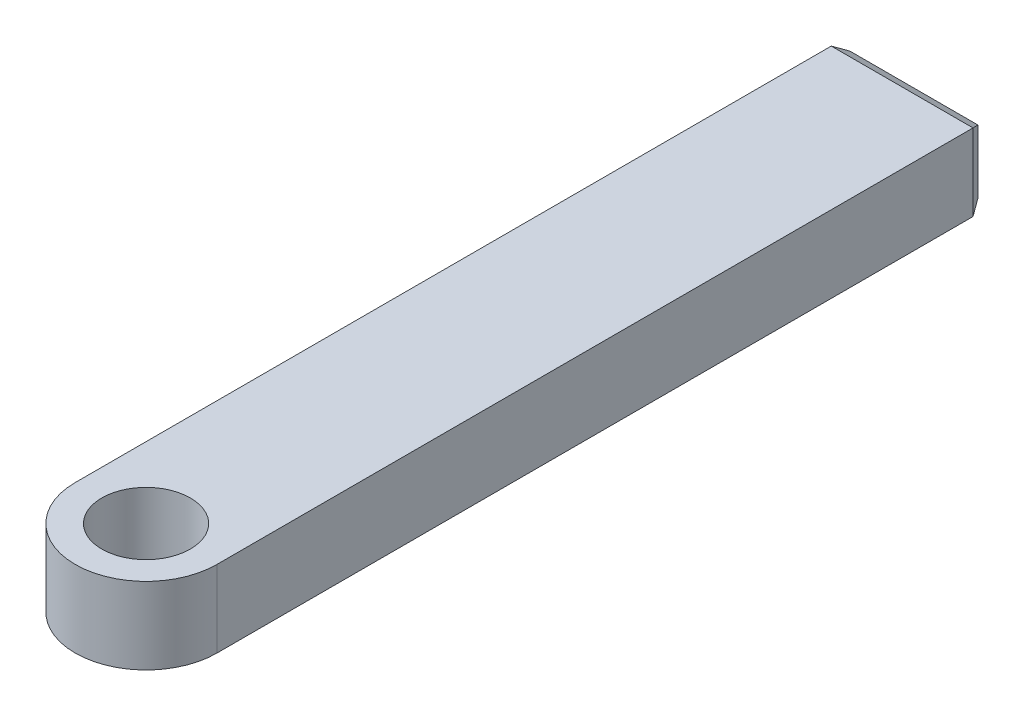
ISO-10303-21;
HEADER;
FILE_DESCRIPTION(('STEP AP214'),'2;1');
FILE_NAME('part.step','',(''),(''),'','','');
FILE_SCHEMA(('AUTOMOTIVE_DESIGN { 1 0 10303 214 1 1 1 1 }'));
ENDSEC;
DATA;
#1=APPLICATION_CONTEXT('core data for automotive mechanical design processes');
#2=APPLICATION_PROTOCOL_DEFINITION('international standard','automotive_design',2000,#1);
#3=PRODUCT_CONTEXT('',#1,'mechanical');
#4=PRODUCT('Part','Part','',(#3));
#5=PRODUCT_RELATED_PRODUCT_CATEGORY('part','',(#4));
#6=PRODUCT_DEFINITION_FORMATION('','',#4);
#7=PRODUCT_DEFINITION_CONTEXT('part definition',#1,'design');
#8=PRODUCT_DEFINITION('design','',#6,#7);
#9=PRODUCT_DEFINITION_SHAPE('','',#8);
#10=(LENGTH_UNIT() NAMED_UNIT(*) SI_UNIT(.MILLI.,.METRE.));
#11=(NAMED_UNIT(*) PLANE_ANGLE_UNIT() SI_UNIT($,.RADIAN.));
#12=(NAMED_UNIT(*) SI_UNIT($,.STERADIAN.) SOLID_ANGLE_UNIT());
#13=UNCERTAINTY_MEASURE_WITH_UNIT(LENGTH_MEASURE(1.E-05),#10,'distance_accuracy_value','');
#14=(GEOMETRIC_REPRESENTATION_CONTEXT(3) GLOBAL_UNCERTAINTY_ASSIGNED_CONTEXT((#13)) GLOBAL_UNIT_ASSIGNED_CONTEXT((#10,
#11,#12)) REPRESENTATION_CONTEXT('',''));
#15=CARTESIAN_POINT('',(0.,0.,0.));
#16=DIRECTION('',(0.,0.,1.));
#17=DIRECTION('',(1.,0.,0.));
#18=AXIS2_PLACEMENT_3D('',#15,#16,#17);
#19=CARTESIAN_POINT('',(0.,6.5,0.));
#20=DIRECTION('',(0.,1.,0.));
#21=DIRECTION('',(0.,0.,1.));
#22=AXIS2_PLACEMENT_3D('',#19,#20,#21);
#23=PLANE('',#22);
#24=DIRECTION('',(0.,0.,-1.));
#25=VECTOR('',#24,1.);
#26=CARTESIAN_POINT('',(6.,6.5,-65.));
#27=LINE('',#26,#25);
#28=CARTESIAN_POINT('',(6.,6.5,0.));
#29=VERTEX_POINT('',#28);
#30=CARTESIAN_POINT('',(6.,6.5,-64.));
#31=VERTEX_POINT('',#30);
#32=EDGE_CURVE('E88',#29,#31,#27,.T.);
#33=ORIENTED_EDGE('',*,*,#32,.T.);
#34=DIRECTION('',(-1.,0.,0.));
#35=VECTOR('',#34,1.);
#36=CARTESIAN_POINT('',(-6.,6.5,-64.));
#37=LINE('',#36,#35);
#38=CARTESIAN_POINT('',(-6.,6.5,-64.));
#39=VERTEX_POINT('',#38);
#40=EDGE_CURVE('E58',#31,#39,#37,.T.);
#41=ORIENTED_EDGE('',*,*,#40,.T.);
#42=DIRECTION('',(0.,0.,1.));
#43=VECTOR('',#42,1.);
#44=CARTESIAN_POINT('',(-6.,6.5,0.));
#45=LINE('',#44,#43);
#46=CARTESIAN_POINT('',(-6.,6.5,0.));
#47=VERTEX_POINT('',#46);
#48=EDGE_CURVE('E97',#39,#47,#45,.T.);
#49=ORIENTED_EDGE('',*,*,#48,.T.);
#50=CARTESIAN_POINT('',(0.,6.5,0.));
#51=DIRECTION('',(0.,1.,0.));
#52=DIRECTION('',(0.,0.,1.));
#53=AXIS2_PLACEMENT_3D('',#50,#51,#52);
#54=CIRCLE('',#53,6.);
#55=EDGE_CURVE('E98',#47,#29,#54,.T.);
#56=ORIENTED_EDGE('',*,*,#55,.T.);
#57=EDGE_LOOP('',(#33,#41,#49,#56));
#58=FACE_BOUND('',#57,.T.);
#59=CARTESIAN_POINT('',(0.,6.5,0.));
#60=DIRECTION('',(0.,1.,0.));
#61=DIRECTION('',(0.,0.,1.));
#62=AXIS2_PLACEMENT_3D('',#59,#60,#61);
#63=CIRCLE('',#62,3.75);
#64=CARTESIAN_POINT('',(0.,6.5,-3.75));
#65=VERTEX_POINT('',#64);
#66=EDGE_CURVE('E142',#65,#65,#63,.T.);
#67=ORIENTED_EDGE('',*,*,#66,.F.);
#68=EDGE_LOOP('',(#67));
#69=FACE_BOUND('',#68,.T.);
#70=ADVANCED_FACE('F34',(#58,#69),#23,.T.);
#71=CARTESIAN_POINT('',(0.,0.,0.));
#72=DIRECTION('',(0.,1.,0.));
#73=DIRECTION('',(0.,0.,1.));
#74=AXIS2_PLACEMENT_3D('',#71,#72,#73);
#75=PLANE('',#74);
#76=DIRECTION('',(0.,0.,1.));
#77=VECTOR('',#76,1.);
#78=CARTESIAN_POINT('',(-6.,0.,0.));
#79=LINE('',#78,#77);
#80=CARTESIAN_POINT('',(-6.,0.,-64.));
#81=VERTEX_POINT('',#80);
#82=CARTESIAN_POINT('',(-6.,0.,0.));
#83=VERTEX_POINT('',#82);
#84=EDGE_CURVE('E105',#81,#83,#79,.T.);
#85=ORIENTED_EDGE('',*,*,#84,.F.);
#86=DIRECTION('',(1.,0.,0.));
#87=VECTOR('',#86,1.);
#88=CARTESIAN_POINT('',(0.,0.,-64.));
#89=LINE('',#88,#87);
#90=CARTESIAN_POINT('',(6.,0.,-64.));
#91=VERTEX_POINT('',#90);
#92=EDGE_CURVE('E11',#81,#91,#89,.T.);
#93=ORIENTED_EDGE('',*,*,#92,.T.);
#94=DIRECTION('',(0.,0.,-1.));
#95=VECTOR('',#94,1.);
#96=CARTESIAN_POINT('',(6.,0.,-65.));
#97=LINE('',#96,#95);
#98=CARTESIAN_POINT('',(6.,0.,0.));
#99=VERTEX_POINT('',#98);
#100=EDGE_CURVE('E151',#99,#91,#97,.T.);
#101=ORIENTED_EDGE('',*,*,#100,.F.);
#102=CARTESIAN_POINT('',(0.,0.,0.));
#103=DIRECTION('',(0.,1.,0.));
#104=DIRECTION('',(0.,0.,1.));
#105=AXIS2_PLACEMENT_3D('',#102,#103,#104);
#106=CIRCLE('',#105,6.);
#107=EDGE_CURVE('E109',#83,#99,#106,.T.);
#108=ORIENTED_EDGE('',*,*,#107,.F.);
#109=EDGE_LOOP('',(#85,#93,#101,#108));
#110=FACE_BOUND('',#109,.T.);
#111=CARTESIAN_POINT('',(0.,0.,0.));
#112=DIRECTION('',(0.,1.,0.));
#113=DIRECTION('',(0.,0.,1.));
#114=AXIS2_PLACEMENT_3D('',#111,#112,#113);
#115=CIRCLE('',#114,3.75);
#116=CARTESIAN_POINT('',(0.,0.,-3.75));
#117=VERTEX_POINT('',#116);
#118=EDGE_CURVE('E137',#117,#117,#115,.T.);
#119=ORIENTED_EDGE('',*,*,#118,.T.);
#120=EDGE_LOOP('',(#119));
#121=FACE_BOUND('',#120,.T.);
#122=ADVANCED_FACE('F154',(#110,#121),#75,.F.);
#123=CARTESIAN_POINT('',(0.,6.5,0.));
#124=DIRECTION('',(0.,-1.,0.));
#125=DIRECTION('',(0.,0.,-1.));
#126=AXIS2_PLACEMENT_3D('',#123,#124,#125);
#127=CYLINDRICAL_SURFACE('',#126,6.);
#128=ORIENTED_EDGE('',*,*,#107,.T.);
#129=DIRECTION('',(0.,-1.,0.));
#130=VECTOR('',#129,1.);
#131=CARTESIAN_POINT('',(6.,6.5,0.));
#132=LINE('',#131,#130);
#133=EDGE_CURVE('E93',#29,#99,#132,.T.);
#134=ORIENTED_EDGE('',*,*,#133,.F.);
#135=ORIENTED_EDGE('',*,*,#55,.F.);
#136=DIRECTION('',(0.,-1.,0.));
#137=VECTOR('',#136,1.);
#138=CARTESIAN_POINT('',(-6.,6.5,0.));
#139=LINE('',#138,#137);
#140=EDGE_CURVE('E111',#47,#83,#139,.T.);
#141=ORIENTED_EDGE('',*,*,#140,.T.);
#142=EDGE_LOOP('',(#128,#134,#135,#141));
#143=FACE_BOUND('',#142,.T.);
#144=ADVANCED_FACE('F107',(#143),#127,.T.);
#145=CARTESIAN_POINT('',(6.,6.5,-65.));
#146=DIRECTION('',(-1.,0.,0.));
#147=DIRECTION('',(0.,0.,1.));
#148=AXIS2_PLACEMENT_3D('',#145,#146,#147);
#149=PLANE('',#148);
#150=ORIENTED_EDGE('',*,*,#100,.T.);
#151=DIRECTION('',(0.,1.,0.));
#152=VECTOR('',#151,1.);
#153=CARTESIAN_POINT('',(6.,6.5,-64.));
#154=LINE('',#153,#152);
#155=EDGE_CURVE('E96',#91,#31,#154,.T.);
#156=ORIENTED_EDGE('',*,*,#155,.T.);
#157=ORIENTED_EDGE('',*,*,#32,.F.);
#158=ORIENTED_EDGE('',*,*,#133,.T.);
#159=EDGE_LOOP('',(#150,#156,#157,#158));
#160=FACE_BOUND('',#159,.T.);
#161=ADVANCED_FACE('F91',(#160),#149,.F.);
#162=CARTESIAN_POINT('',(-6.,6.5,-65.));
#163=DIRECTION('',(0.,0.,1.));
#164=DIRECTION('',(1.,0.,0.));
#165=AXIS2_PLACEMENT_3D('',#162,#163,#164);
#166=PLANE('',#165);
#167=DIRECTION('',(1.,0.,0.));
#168=VECTOR('',#167,1.);
#169=CARTESIAN_POINT('',(6.,5.92264973081037,-65.));
#170=LINE('',#169,#168);
#171=CARTESIAN_POINT('',(-5.42264973081037,5.92264973081037,-65.));
#172=VERTEX_POINT('',#171);
#173=CARTESIAN_POINT('',(5.42264973081037,5.92264973081037,-65.));
#174=VERTEX_POINT('',#173);
#175=EDGE_CURVE('E119',#172,#174,#170,.T.);
#176=ORIENTED_EDGE('',*,*,#175,.T.);
#177=DIRECTION('',(0.,-1.,0.));
#178=VECTOR('',#177,1.);
#179=CARTESIAN_POINT('',(5.42264973081037,6.5,-65.));
#180=LINE('',#179,#178);
#181=CARTESIAN_POINT('',(5.42264973081037,0.577350269189626,-65.));
#182=VERTEX_POINT('',#181);
#183=EDGE_CURVE('E121',#174,#182,#180,.T.);
#184=ORIENTED_EDGE('',*,*,#183,.T.);
#185=DIRECTION('',(-1.,0.,0.));
#186=VECTOR('',#185,1.);
#187=CARTESIAN_POINT('',(-6.,0.577350269189626,-65.));
#188=LINE('',#187,#186);
#189=CARTESIAN_POINT('',(-5.42264973081037,0.577350269189626,-65.));
#190=VERTEX_POINT('',#189);
#191=EDGE_CURVE('E110',#182,#190,#188,.T.);
#192=ORIENTED_EDGE('',*,*,#191,.T.);
#193=DIRECTION('',(0.,1.,0.));
#194=VECTOR('',#193,1.);
#195=CARTESIAN_POINT('',(-5.42264973081037,6.5,-65.));
#196=LINE('',#195,#194);
#197=EDGE_CURVE('E113',#190,#172,#196,.T.);
#198=ORIENTED_EDGE('',*,*,#197,.T.);
#199=EDGE_LOOP('',(#176,#184,#192,#198));
#200=FACE_BOUND('',#199,.T.);
#201=ADVANCED_FACE('F163',(#200),#166,.F.);
#202=CARTESIAN_POINT('',(-6.,6.5,0.));
#203=DIRECTION('',(1.,0.,0.));
#204=DIRECTION('',(0.,0.,-1.));
#205=AXIS2_PLACEMENT_3D('',#202,#203,#204);
#206=PLANE('',#205);
#207=ORIENTED_EDGE('',*,*,#48,.F.);
#208=DIRECTION('',(0.,-1.,0.));
#209=VECTOR('',#208,1.);
#210=CARTESIAN_POINT('',(-6.,6.5,-64.));
#211=LINE('',#210,#209);
#212=EDGE_CURVE('E43',#39,#81,#211,.T.);
#213=ORIENTED_EDGE('',*,*,#212,.T.);
#214=ORIENTED_EDGE('',*,*,#84,.T.);
#215=ORIENTED_EDGE('',*,*,#140,.F.);
#216=EDGE_LOOP('',(#207,#213,#214,#215));
#217=FACE_BOUND('',#216,.T.);
#218=ADVANCED_FACE('F152',(#217),#206,.F.);
#219=CARTESIAN_POINT('',(0.,6.5,0.));
#220=DIRECTION('',(0.,-1.,0.));
#221=DIRECTION('',(0.,0.,-1.));
#222=AXIS2_PLACEMENT_3D('',#219,#220,#221);
#223=CYLINDRICAL_SURFACE('',#222,3.75);
#224=CARTESIAN_POINT('',(0.,6.5,-3.75));
#225=CARTESIAN_POINT('',(0.,6.43229166666667,-3.75));
#226=CARTESIAN_POINT('',(0.,6.36458333333333,-3.75));
#227=CARTESIAN_POINT('',(0.,6.22916666666667,-3.75));
#228=CARTESIAN_POINT('',(0.,6.16145833333333,-3.75));
#229=CARTESIAN_POINT('',(0.,6.02604166666667,-3.75));
#230=CARTESIAN_POINT('',(0.,5.95833333333333,-3.75));
#231=CARTESIAN_POINT('',(0.,5.82291666666667,-3.75));
#232=CARTESIAN_POINT('',(0.,5.75520833333333,-3.75));
#233=CARTESIAN_POINT('',(0.,5.61979166666667,-3.75));
#234=CARTESIAN_POINT('',(0.,5.55208333333333,-3.75));
#235=CARTESIAN_POINT('',(0.,5.41666666666667,-3.75));
#236=CARTESIAN_POINT('',(0.,5.34895833333333,-3.75));
#237=CARTESIAN_POINT('',(0.,5.21354166666667,-3.75));
#238=CARTESIAN_POINT('',(0.,5.14583333333333,-3.75));
#239=CARTESIAN_POINT('',(0.,5.01041666666667,-3.75));
#240=CARTESIAN_POINT('',(0.,4.94270833333333,-3.75));
#241=CARTESIAN_POINT('',(0.,4.80729166666667,-3.75));
#242=CARTESIAN_POINT('',(0.,4.73958333333333,-3.75));
#243=CARTESIAN_POINT('',(0.,4.60416666666667,-3.75));
#244=CARTESIAN_POINT('',(0.,4.53645833333333,-3.75));
#245=CARTESIAN_POINT('',(0.,4.40104166666667,-3.75));
#246=CARTESIAN_POINT('',(0.,4.33333333333333,-3.75));
#247=CARTESIAN_POINT('',(0.,4.19791666666667,-3.75));
#248=CARTESIAN_POINT('',(0.,4.13020833333333,-3.75));
#249=CARTESIAN_POINT('',(0.,3.99479166666667,-3.75));
#250=CARTESIAN_POINT('',(0.,3.92708333333333,-3.75));
#251=CARTESIAN_POINT('',(0.,3.79166666666667,-3.75));
#252=CARTESIAN_POINT('',(0.,3.72395833333333,-3.75));
#253=CARTESIAN_POINT('',(0.,3.58854166666667,-3.75));
#254=CARTESIAN_POINT('',(0.,3.52083333333333,-3.75));
#255=CARTESIAN_POINT('',(0.,3.38541666666667,-3.75));
#256=CARTESIAN_POINT('',(0.,3.31770833333333,-3.75));
#257=CARTESIAN_POINT('',(0.,3.18229166666667,-3.75));
#258=CARTESIAN_POINT('',(0.,3.11458333333333,-3.75));
#259=CARTESIAN_POINT('',(0.,2.97916666666667,-3.75));
#260=CARTESIAN_POINT('',(0.,2.91145833333333,-3.75));
#261=CARTESIAN_POINT('',(0.,2.77604166666667,-3.75));
#262=CARTESIAN_POINT('',(0.,2.70833333333333,-3.75));
#263=CARTESIAN_POINT('',(0.,2.57291666666667,-3.75));
#264=CARTESIAN_POINT('',(0.,2.50520833333333,-3.75));
#265=CARTESIAN_POINT('',(0.,2.36979166666667,-3.75));
#266=CARTESIAN_POINT('',(0.,2.30208333333333,-3.75));
#267=CARTESIAN_POINT('',(0.,2.16666666666667,-3.75));
#268=CARTESIAN_POINT('',(0.,2.09895833333333,-3.75));
#269=CARTESIAN_POINT('',(0.,1.96354166666667,-3.75));
#270=CARTESIAN_POINT('',(0.,1.89583333333333,-3.75));
#271=CARTESIAN_POINT('',(0.,1.76041666666667,-3.75));
#272=CARTESIAN_POINT('',(0.,1.69270833333333,-3.75));
#273=CARTESIAN_POINT('',(0.,1.55729166666667,-3.75));
#274=CARTESIAN_POINT('',(0.,1.48958333333333,-3.75));
#275=CARTESIAN_POINT('',(0.,1.35416666666667,-3.75));
#276=CARTESIAN_POINT('',(0.,1.28645833333333,-3.75));
#277=CARTESIAN_POINT('',(0.,1.15104166666667,-3.75));
#278=CARTESIAN_POINT('',(0.,1.08333333333333,-3.75));
#279=CARTESIAN_POINT('',(0.,0.947916666666667,-3.75));
#280=CARTESIAN_POINT('',(0.,0.880208333333333,-3.75));
#281=CARTESIAN_POINT('',(0.,0.744791666666667,-3.75));
#282=CARTESIAN_POINT('',(0.,0.677083333333333,-3.75));
#283=CARTESIAN_POINT('',(0.,0.541666666666667,-3.75));
#284=CARTESIAN_POINT('',(0.,0.473958333333333,-3.75));
#285=CARTESIAN_POINT('',(0.,0.338541666666667,-3.75));
#286=CARTESIAN_POINT('',(0.,0.270833333333334,-3.75));
#287=CARTESIAN_POINT('',(0.,0.135416666666667,-3.75));
#288=CARTESIAN_POINT('',(0.,0.0677083333333334,-3.75));
#289=CARTESIAN_POINT('',(0.,0.,-3.75));
#290=B_SPLINE_CURVE_WITH_KNOTS('',3,(#224,#225,#226,#227,#228,#229,#230,#231,#232,#233,#234,
#235,#236,#237,#238,#239,#240,#241,#242,#243,#244,#245,#246,#247,#248,#249,#250,#251,#252,#253,
#254,#255,#256,#257,#258,#259,#260,#261,#262,#263,#264,#265,#266,#267,#268,#269,#270,#271,#272,
#273,#274,#275,#276,#277,#278,#279,#280,#281,#282,#283,#284,#285,#286,#287,#288,#289),
.UNSPECIFIED.,.F.,.F.,(4,2,2,2,2,2,2,2,2,2,2,2,2,2,2,2,2,2,2,2,2,2,2,2,2,2,2,2,2,2,2,2,4),(0.,
0.203125,0.40625,0.609375000000001,0.812500000000001,1.015625,1.21875,1.421875,1.625,1.828125,
2.03125,2.234375,2.4375,2.640625,2.84375,3.046875,3.25,3.453125,3.65625,3.859375,4.0625,
4.265625,4.46875,4.671875,4.875,5.078125,5.28125,5.484375,5.6875,5.890625,6.09375,6.296875,6.5),.UNSPECIFIED.);
#291=EDGE_CURVE('BSEAM171',#65,#117,#290,.T.);
#292=ORIENTED_EDGE('',*,*,#66,.T.);
#293=ORIENTED_EDGE('',*,*,#118,.F.);
#294=ORIENTED_EDGE('',*,*,#291,.T.);
#295=ORIENTED_EDGE('',*,*,#291,.F.);
#296=EDGE_LOOP('',(#292,#294,#293,#295));
#297=FACE_BOUND('',#296,.T.);
#298=ADVANCED_FACE('F171',(#297),#223,.F.);
#299=CARTESIAN_POINT('',(-6.,6.5,-64.));
#300=DIRECTION('',(0.866025403784439,0.,0.5));
#301=DIRECTION('',(0.,-1.,0.));
#302=AXIS2_PLACEMENT_3D('',#299,#300,#301);
#303=PLANE('',#302);
#304=DIRECTION('',(0.447213595499958,0.447213595499958,-0.774596669241483));
#305=VECTOR('',#304,1.);
#306=CARTESIAN_POINT('',(-5.5381197846483,0.461880215351701,-64.8));
#307=LINE('',#306,#305);
#308=EDGE_CURVE('E130',#81,#190,#307,.T.);
#309=ORIENTED_EDGE('',*,*,#308,.F.);
#310=ORIENTED_EDGE('',*,*,#212,.F.);
#311=DIRECTION('',(-0.447213595499958,0.447213595499958,0.774596669241483));
#312=VECTOR('',#311,1.);
#313=CARTESIAN_POINT('',(-6.,6.5,-64.));
#314=LINE('',#313,#312);
#315=EDGE_CURVE('E38',#172,#39,#314,.T.);
#316=ORIENTED_EDGE('',*,*,#315,.F.);
#317=ORIENTED_EDGE('',*,*,#197,.F.);
#318=EDGE_LOOP('',(#309,#310,#316,#317));
#319=FACE_BOUND('',#318,.T.);
#320=ADVANCED_FACE('F36',(#319),#303,.F.);
#321=CARTESIAN_POINT('',(0.,6.5,-64.));
#322=DIRECTION('',(0.,0.866025403784439,-0.5));
#323=DIRECTION('',(1.,0.,0.));
#324=AXIS2_PLACEMENT_3D('',#321,#322,#323);
#325=PLANE('',#324);
#326=ORIENTED_EDGE('',*,*,#315,.T.);
#327=ORIENTED_EDGE('',*,*,#40,.F.);
#328=DIRECTION('',(0.447213595499958,0.447213595499958,0.774596669241483));
#329=VECTOR('',#328,1.);
#330=CARTESIAN_POINT('',(4.8,5.3,-66.0784609690827));
#331=LINE('',#330,#329);
#332=EDGE_CURVE('E129',#174,#31,#331,.T.);
#333=ORIENTED_EDGE('',*,*,#332,.F.);
#334=ORIENTED_EDGE('',*,*,#175,.F.);
#335=EDGE_LOOP('',(#326,#327,#333,#334));
#336=FACE_BOUND('',#335,.T.);
#337=ADVANCED_FACE('F164',(#336),#325,.T.);
#338=CARTESIAN_POINT('',(-6.,0.577350269189626,-65.));
#339=DIRECTION('',(0.,0.866025403784439,0.5));
#340=DIRECTION('',(-1.,0.,0.));
#341=AXIS2_PLACEMENT_3D('',#338,#339,#340);
#342=PLANE('',#341);
#343=ORIENTED_EDGE('',*,*,#308,.T.);
#344=ORIENTED_EDGE('',*,*,#191,.F.);
#345=DIRECTION('',(0.447213595499958,-0.447213595499958,0.774596669241483));
#346=VECTOR('',#345,1.);
#347=CARTESIAN_POINT('',(3.1381197846483,2.8618802153517,-68.9569219381653));
#348=LINE('',#347,#346);
#349=EDGE_CURVE('E127',#91,#182,#348,.F.);
#350=ORIENTED_EDGE('',*,*,#349,.F.);
#351=ORIENTED_EDGE('',*,*,#92,.F.);
#352=EDGE_LOOP('',(#343,#344,#350,#351));
#353=FACE_BOUND('',#352,.T.);
#354=ADVANCED_FACE('F160',(#353),#342,.F.);
#355=CARTESIAN_POINT('',(5.42264973081037,6.5,-65.));
#356=DIRECTION('',(-0.866025403784439,0.,0.5));
#357=DIRECTION('',(0.,-1.,0.));
#358=AXIS2_PLACEMENT_3D('',#355,#356,#357);
#359=PLANE('',#358);
#360=ORIENTED_EDGE('',*,*,#332,.T.);
#361=ORIENTED_EDGE('',*,*,#155,.F.);
#362=ORIENTED_EDGE('',*,*,#349,.T.);
#363=ORIENTED_EDGE('',*,*,#183,.F.);
#364=EDGE_LOOP('',(#360,#361,#362,#363));
#365=FACE_BOUND('',#364,.T.);
#366=ADVANCED_FACE('F157',(#365),#359,.F.);
#367=CLOSED_SHELL('',(#70,#122,#144,#161,#201,#218,#298,#320,#337,#354,#366));
#368=MANIFOLD_SOLID_BREP('B2',#367);
#369=ADVANCED_BREP_SHAPE_REPRESENTATION('',(#18,#368),#14);
#370=SHAPE_DEFINITION_REPRESENTATION(#9,#369);
ENDSEC;
END-ISO-10303-21;
